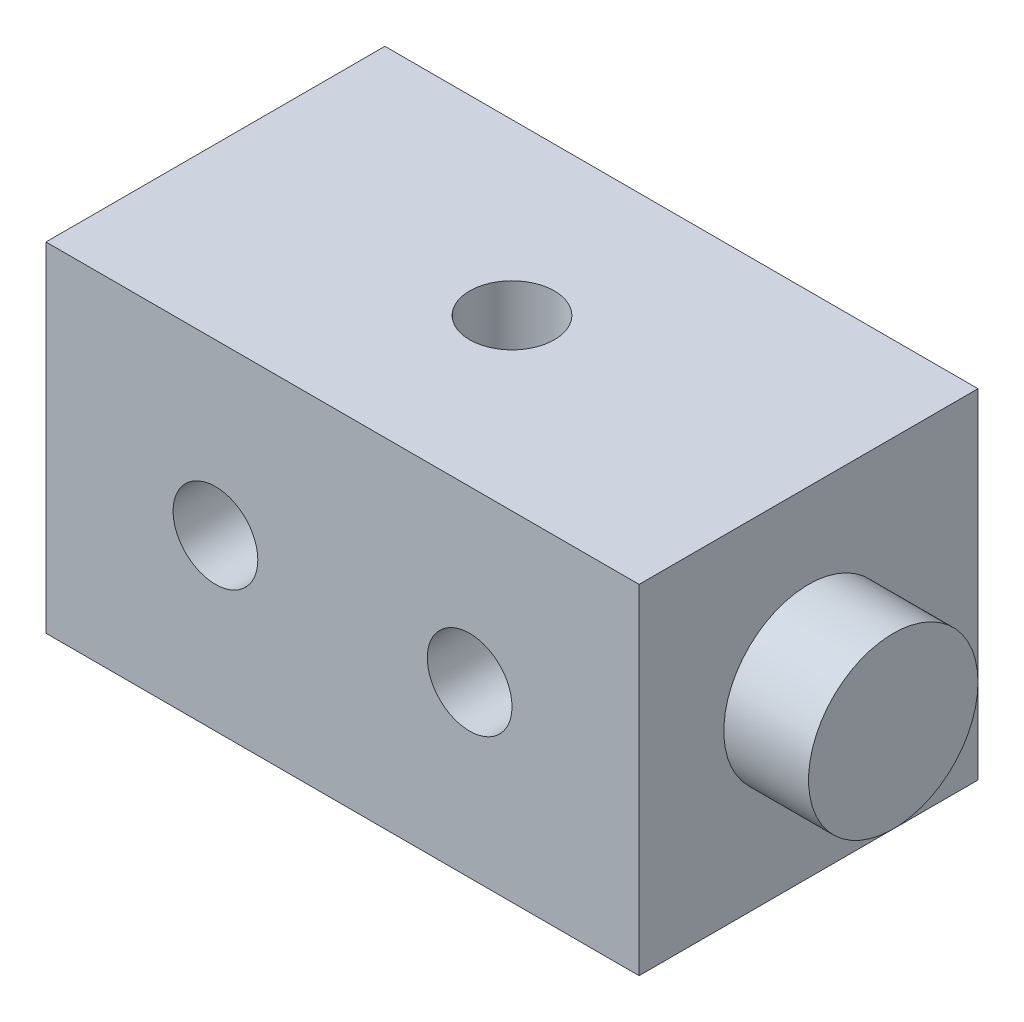
ISO-10303-21;
HEADER;
FILE_DESCRIPTION(('STEP AP214'),'2;1');
FILE_NAME('part.step','',(''),(''),'','','');
FILE_SCHEMA(('AUTOMOTIVE_DESIGN { 1 0 10303 214 1 1 1 1 }'));
ENDSEC;
DATA;
#1=APPLICATION_CONTEXT('core data for automotive mechanical design processes');
#2=APPLICATION_PROTOCOL_DEFINITION('international standard','automotive_design',2000,#1);
#3=PRODUCT_CONTEXT('',#1,'mechanical');
#4=PRODUCT('Part','Part','',(#3));
#5=PRODUCT_RELATED_PRODUCT_CATEGORY('part','',(#4));
#6=PRODUCT_DEFINITION_FORMATION('','',#4);
#7=PRODUCT_DEFINITION_CONTEXT('part definition',#1,'design');
#8=PRODUCT_DEFINITION('design','',#6,#7);
#9=PRODUCT_DEFINITION_SHAPE('','',#8);
#10=(LENGTH_UNIT() NAMED_UNIT(*) SI_UNIT(.MILLI.,.METRE.));
#11=(NAMED_UNIT(*) PLANE_ANGLE_UNIT() SI_UNIT($,.RADIAN.));
#12=(NAMED_UNIT(*) SI_UNIT($,.STERADIAN.) SOLID_ANGLE_UNIT());
#13=UNCERTAINTY_MEASURE_WITH_UNIT(LENGTH_MEASURE(1.E-05),#10,'distance_accuracy_value','');
#14=(GEOMETRIC_REPRESENTATION_CONTEXT(3) GLOBAL_UNCERTAINTY_ASSIGNED_CONTEXT((#13)) GLOBAL_UNIT_ASSIGNED_CONTEXT((#10,
#11,#12)) REPRESENTATION_CONTEXT('',''));
#15=CARTESIAN_POINT('',(0.,0.,0.));
#16=DIRECTION('',(0.,0.,1.));
#17=DIRECTION('',(1.,0.,0.));
#18=AXIS2_PLACEMENT_3D('',#15,#16,#17);
#19=CARTESIAN_POINT('',(0.,0.,25.4));
#20=DIRECTION('',(0.,0.,-1.));
#21=DIRECTION('',(-1.,0.,0.));
#22=AXIS2_PLACEMENT_3D('',#19,#20,#21);
#23=PLANE('',#22);
#24=DIRECTION('',(0.,-1.,0.));
#25=VECTOR('',#24,1.);
#26=CARTESIAN_POINT('',(0.,0.,25.4));
#27=LINE('',#26,#25);
#28=CARTESIAN_POINT('',(0.,25.4,25.4));
#29=VERTEX_POINT('',#28);
#30=CARTESIAN_POINT('',(0.,0.,25.4));
#31=VERTEX_POINT('',#30);
#32=EDGE_CURVE('E93',#29,#31,#27,.T.);
#33=ORIENTED_EDGE('',*,*,#32,.T.);
#34=DIRECTION('',(1.,0.,0.));
#35=VECTOR('',#34,1.);
#36=CARTESIAN_POINT('',(0.,0.,25.4));
#37=LINE('',#36,#35);
#38=CARTESIAN_POINT('',(44.45,0.,25.4));
#39=VERTEX_POINT('',#38);
#40=EDGE_CURVE('E88',#31,#39,#37,.T.);
#41=ORIENTED_EDGE('',*,*,#40,.T.);
#42=DIRECTION('',(0.,1.,0.));
#43=VECTOR('',#42,1.);
#44=CARTESIAN_POINT('',(44.45,0.,25.4));
#45=LINE('',#44,#43);
#46=CARTESIAN_POINT('',(44.45,25.4,25.4));
#47=VERTEX_POINT('',#46);
#48=EDGE_CURVE('E91',#39,#47,#45,.T.);
#49=ORIENTED_EDGE('',*,*,#48,.T.);
#50=DIRECTION('',(-1.,0.,0.));
#51=VECTOR('',#50,1.);
#52=CARTESIAN_POINT('',(0.,25.4,25.4));
#53=LINE('',#52,#51);
#54=EDGE_CURVE('E57',#47,#29,#53,.T.);
#55=ORIENTED_EDGE('',*,*,#54,.T.);
#56=EDGE_LOOP('',(#33,#41,#49,#55));
#57=FACE_BOUND('',#56,.T.);
#58=CARTESIAN_POINT('',(12.7,12.7,25.4));
#59=DIRECTION('',(0.,0.,1.));
#60=DIRECTION('',(1.,0.,0.));
#61=AXIS2_PLACEMENT_3D('',#58,#59,#60);
#62=CIRCLE('',#61,3.175);
#63=CARTESIAN_POINT('',(15.875,12.7,25.4));
#64=VERTEX_POINT('',#63);
#65=EDGE_CURVE('E114',#64,#64,#62,.T.);
#66=ORIENTED_EDGE('',*,*,#65,.F.);
#67=EDGE_LOOP('',(#66));
#68=FACE_BOUND('',#67,.T.);
#69=CARTESIAN_POINT('',(31.75,12.7,25.4));
#70=DIRECTION('',(0.,0.,1.));
#71=DIRECTION('',(1.,0.,0.));
#72=AXIS2_PLACEMENT_3D('',#69,#70,#71);
#73=CIRCLE('',#72,3.175);
#74=CARTESIAN_POINT('',(34.925,12.7,25.4));
#75=VERTEX_POINT('',#74);
#76=EDGE_CURVE('E136',#75,#75,#73,.T.);
#77=ORIENTED_EDGE('',*,*,#76,.F.);
#78=EDGE_LOOP('',(#77));
#79=FACE_BOUND('',#78,.T.);
#80=ADVANCED_FACE('F38',(#57,#68,#79),#23,.F.);
#81=CARTESIAN_POINT('',(0.,0.,0.));
#82=DIRECTION('',(0.,0.,-1.));
#83=DIRECTION('',(-1.,0.,0.));
#84=AXIS2_PLACEMENT_3D('',#81,#82,#83);
#85=PLANE('',#84);
#86=CARTESIAN_POINT('',(12.7,12.7,0.));
#87=DIRECTION('',(0.,0.,1.));
#88=DIRECTION('',(1.,0.,0.));
#89=AXIS2_PLACEMENT_3D('',#86,#87,#88);
#90=CIRCLE('',#89,3.175);
#91=CARTESIAN_POINT('',(15.875,12.7,0.));
#92=VERTEX_POINT('',#91);
#93=EDGE_CURVE('E132',#92,#92,#90,.T.);
#94=ORIENTED_EDGE('',*,*,#93,.T.);
#95=EDGE_LOOP('',(#94));
#96=FACE_BOUND('',#95,.T.);
#97=DIRECTION('',(0.,-1.,0.));
#98=VECTOR('',#97,1.);
#99=CARTESIAN_POINT('',(0.,0.,0.));
#100=LINE('',#99,#98);
#101=CARTESIAN_POINT('',(0.,25.4,0.));
#102=VERTEX_POINT('',#101);
#103=CARTESIAN_POINT('',(0.,0.,0.));
#104=VERTEX_POINT('',#103);
#105=EDGE_CURVE('E110',#102,#104,#100,.T.);
#106=ORIENTED_EDGE('',*,*,#105,.F.);
#107=DIRECTION('',(-1.,0.,0.));
#108=VECTOR('',#107,1.);
#109=CARTESIAN_POINT('',(0.,25.4,0.));
#110=LINE('',#109,#108);
#111=CARTESIAN_POINT('',(44.45,25.4,0.));
#112=VERTEX_POINT('',#111);
#113=EDGE_CURVE('E80',#112,#102,#110,.T.);
#114=ORIENTED_EDGE('',*,*,#113,.F.);
#115=DIRECTION('',(0.,1.,0.));
#116=VECTOR('',#115,1.);
#117=CARTESIAN_POINT('',(44.45,0.,0.));
#118=LINE('',#117,#116);
#119=CARTESIAN_POINT('',(44.45,0.,0.));
#120=VERTEX_POINT('',#119);
#121=EDGE_CURVE('E74',#120,#112,#118,.T.);
#122=ORIENTED_EDGE('',*,*,#121,.F.);
#123=DIRECTION('',(1.,0.,0.));
#124=VECTOR('',#123,1.);
#125=CARTESIAN_POINT('',(0.,0.,0.));
#126=LINE('',#125,#124);
#127=EDGE_CURVE('E99',#104,#120,#126,.T.);
#128=ORIENTED_EDGE('',*,*,#127,.F.);
#129=EDGE_LOOP('',(#106,#114,#122,#128));
#130=FACE_BOUND('',#129,.T.);
#131=CARTESIAN_POINT('',(31.75,12.7,0.));
#132=DIRECTION('',(0.,0.,1.));
#133=DIRECTION('',(1.,0.,0.));
#134=AXIS2_PLACEMENT_3D('',#131,#132,#133);
#135=CIRCLE('',#134,3.175);
#136=CARTESIAN_POINT('',(34.925,12.7,0.));
#137=VERTEX_POINT('',#136);
#138=EDGE_CURVE('E140',#137,#137,#135,.T.);
#139=ORIENTED_EDGE('',*,*,#138,.T.);
#140=EDGE_LOOP('',(#139));
#141=FACE_BOUND('',#140,.T.);
#142=ADVANCED_FACE('F127',(#96,#130,#141),#85,.T.);
#143=CARTESIAN_POINT('',(0.,0.,25.4));
#144=DIRECTION('',(1.,0.,0.));
#145=DIRECTION('',(0.,0.,-1.));
#146=AXIS2_PLACEMENT_3D('',#143,#144,#145);
#147=PLANE('',#146);
#148=ORIENTED_EDGE('',*,*,#105,.T.);
#149=DIRECTION('',(0.,0.,-1.));
#150=VECTOR('',#149,1.);
#151=CARTESIAN_POINT('',(0.,0.,25.4));
#152=LINE('',#151,#150);
#153=EDGE_CURVE('E42',#31,#104,#152,.T.);
#154=ORIENTED_EDGE('',*,*,#153,.F.);
#155=ORIENTED_EDGE('',*,*,#32,.F.);
#156=DIRECTION('',(0.,0.,-1.));
#157=VECTOR('',#156,1.);
#158=CARTESIAN_POINT('',(0.,25.4,25.4));
#159=LINE('',#158,#157);
#160=EDGE_CURVE('E106',#29,#102,#159,.T.);
#161=ORIENTED_EDGE('',*,*,#160,.T.);
#162=EDGE_LOOP('',(#148,#154,#155,#161));
#163=FACE_BOUND('',#162,.T.);
#164=ADVANCED_FACE('F40',(#163),#147,.F.);
#165=CARTESIAN_POINT('',(0.,0.,25.4));
#166=DIRECTION('',(0.,1.,0.));
#167=DIRECTION('',(0.,0.,1.));
#168=AXIS2_PLACEMENT_3D('',#165,#166,#167);
#169=PLANE('',#168);
#170=CARTESIAN_POINT('',(22.225,0.,12.7));
#171=DIRECTION('',(0.,1.,0.));
#172=DIRECTION('',(0.,0.,1.));
#173=AXIS2_PLACEMENT_3D('',#170,#171,#172);
#174=CIRCLE('',#173,3.175);
#175=CARTESIAN_POINT('',(22.225,0.,15.875));
#176=VERTEX_POINT('',#175);
#177=EDGE_CURVE('E151',#176,#176,#174,.T.);
#178=ORIENTED_EDGE('',*,*,#177,.T.);
#179=EDGE_LOOP('',(#178));
#180=FACE_BOUND('',#179,.T.);
#181=ORIENTED_EDGE('',*,*,#127,.T.);
#182=DIRECTION('',(0.,0.,-1.));
#183=VECTOR('',#182,1.);
#184=CARTESIAN_POINT('',(44.45,0.,25.4));
#185=LINE('',#184,#183);
#186=EDGE_CURVE('E97',#39,#120,#185,.T.);
#187=ORIENTED_EDGE('',*,*,#186,.F.);
#188=ORIENTED_EDGE('',*,*,#40,.F.);
#189=ORIENTED_EDGE('',*,*,#153,.T.);
#190=EDGE_LOOP('',(#181,#187,#188,#189));
#191=FACE_BOUND('',#190,.T.);
#192=ADVANCED_FACE('F98',(#180,#191),#169,.F.);
#193=CARTESIAN_POINT('',(44.45,0.,25.4));
#194=DIRECTION('',(-1.,0.,0.));
#195=DIRECTION('',(0.,0.,1.));
#196=AXIS2_PLACEMENT_3D('',#193,#194,#195);
#197=PLANE('',#196);
#198=CARTESIAN_POINT('',(44.45,12.7,12.7));
#199=DIRECTION('',(1.,0.,0.));
#200=DIRECTION('',(0.,0.,-1.));
#201=AXIS2_PLACEMENT_3D('',#198,#199,#200);
#202=CIRCLE('',#201,6.35);
#203=CARTESIAN_POINT('',(44.45,12.7,6.35));
#204=VERTEX_POINT('',#203);
#205=EDGE_CURVE('E11',#204,#204,#202,.T.);
#206=ORIENTED_EDGE('',*,*,#205,.F.);
#207=EDGE_LOOP('',(#206));
#208=FACE_BOUND('',#207,.T.);
#209=ORIENTED_EDGE('',*,*,#121,.T.);
#210=DIRECTION('',(0.,0.,-1.));
#211=VECTOR('',#210,1.);
#212=CARTESIAN_POINT('',(44.45,25.4,25.4));
#213=LINE('',#212,#211);
#214=EDGE_CURVE('E101',#47,#112,#213,.T.);
#215=ORIENTED_EDGE('',*,*,#214,.F.);
#216=ORIENTED_EDGE('',*,*,#48,.F.);
#217=ORIENTED_EDGE('',*,*,#186,.T.);
#218=EDGE_LOOP('',(#209,#215,#216,#217));
#219=FACE_BOUND('',#218,.T.);
#220=ADVANCED_FACE('F102',(#208,#219),#197,.F.);
#221=CARTESIAN_POINT('',(0.,25.4,25.4));
#222=DIRECTION('',(0.,-1.,0.));
#223=DIRECTION('',(0.,0.,-1.));
#224=AXIS2_PLACEMENT_3D('',#221,#222,#223);
#225=PLANE('',#224);
#226=CARTESIAN_POINT('',(22.225,25.4,12.7));
#227=DIRECTION('',(0.,1.,0.));
#228=DIRECTION('',(0.,0.,1.));
#229=AXIS2_PLACEMENT_3D('',#226,#227,#228);
#230=CIRCLE('',#229,3.175);
#231=CARTESIAN_POINT('',(22.225,25.4,15.875));
#232=VERTEX_POINT('',#231);
#233=EDGE_CURVE('E152',#232,#232,#230,.T.);
#234=ORIENTED_EDGE('',*,*,#233,.F.);
#235=EDGE_LOOP('',(#234));
#236=FACE_BOUND('',#235,.T.);
#237=ORIENTED_EDGE('',*,*,#113,.T.);
#238=ORIENTED_EDGE('',*,*,#160,.F.);
#239=ORIENTED_EDGE('',*,*,#54,.F.);
#240=ORIENTED_EDGE('',*,*,#214,.T.);
#241=EDGE_LOOP('',(#237,#238,#239,#240));
#242=FACE_BOUND('',#241,.T.);
#243=ADVANCED_FACE('F124',(#236,#242),#225,.F.);
#244=CARTESIAN_POINT('',(12.7,12.7,25.4));
#245=DIRECTION('',(0.,0.,-1.));
#246=DIRECTION('',(-1.,0.,0.));
#247=AXIS2_PLACEMENT_3D('',#244,#245,#246);
#248=CYLINDRICAL_SURFACE('',#247,3.175);
#249=ORIENTED_EDGE('',*,*,#65,.T.);
#250=EDGE_LOOP('',(#249));
#251=FACE_BOUND('',#250,.T.);
#252=ORIENTED_EDGE('',*,*,#93,.F.);
#253=EDGE_LOOP('',(#252));
#254=FACE_BOUND('',#253,.T.);
#255=ADVANCED_FACE('F169',(#251,#254),#248,.F.);
#256=CARTESIAN_POINT('',(31.75,12.7,25.4));
#257=DIRECTION('',(0.,0.,-1.));
#258=DIRECTION('',(-1.,0.,0.));
#259=AXIS2_PLACEMENT_3D('',#256,#257,#258);
#260=CYLINDRICAL_SURFACE('',#259,3.175);
#261=ORIENTED_EDGE('',*,*,#76,.T.);
#262=EDGE_LOOP('',(#261));
#263=FACE_BOUND('',#262,.T.);
#264=ORIENTED_EDGE('',*,*,#138,.F.);
#265=EDGE_LOOP('',(#264));
#266=FACE_BOUND('',#265,.T.);
#267=ADVANCED_FACE('F176',(#263,#266),#260,.F.);
#268=CARTESIAN_POINT('',(50.8,12.7,12.7));
#269=DIRECTION('',(-1.,0.,0.));
#270=DIRECTION('',(0.,0.,1.));
#271=AXIS2_PLACEMENT_3D('',#268,#269,#270);
#272=CYLINDRICAL_SURFACE('',#271,6.35);
#273=CARTESIAN_POINT('',(50.8,12.7,12.7));
#274=DIRECTION('',(1.,0.,0.));
#275=DIRECTION('',(0.,0.,-1.));
#276=AXIS2_PLACEMENT_3D('',#273,#274,#275);
#277=CIRCLE('',#276,6.35);
#278=CARTESIAN_POINT('',(50.8,12.7,6.35));
#279=VERTEX_POINT('',#278);
#280=EDGE_CURVE('E144',#279,#279,#277,.T.);
#281=ORIENTED_EDGE('',*,*,#280,.F.);
#282=EDGE_LOOP('',(#281));
#283=FACE_BOUND('',#282,.T.);
#284=ORIENTED_EDGE('',*,*,#205,.T.);
#285=EDGE_LOOP('',(#284));
#286=FACE_BOUND('',#285,.T.);
#287=ADVANCED_FACE('F192',(#283,#286),#272,.T.);
#288=CARTESIAN_POINT('',(50.8,12.7,12.7));
#289=DIRECTION('',(1.,0.,0.));
#290=DIRECTION('',(0.,0.,-1.));
#291=AXIS2_PLACEMENT_3D('',#288,#289,#290);
#292=PLANE('',#291);
#293=ORIENTED_EDGE('',*,*,#280,.T.);
#294=EDGE_LOOP('',(#293));
#295=FACE_BOUND('',#294,.T.);
#296=ADVANCED_FACE('F164',(#295),#292,.T.);
#297=CARTESIAN_POINT('',(22.225,0.,12.7));
#298=DIRECTION('',(0.,1.,0.));
#299=DIRECTION('',(0.,0.,1.));
#300=AXIS2_PLACEMENT_3D('',#297,#298,#299);
#301=CYLINDRICAL_SURFACE('',#300,3.175);
#302=ORIENTED_EDGE('',*,*,#177,.F.);
#303=EDGE_LOOP('',(#302));
#304=FACE_BOUND('',#303,.T.);
#305=ORIENTED_EDGE('',*,*,#233,.T.);
#306=EDGE_LOOP('',(#305));
#307=FACE_BOUND('',#306,.T.);
#308=ADVANCED_FACE('F161',(#304,#307),#301,.F.);
#309=CLOSED_SHELL('',(#80,#142,#164,#192,#220,#243,#255,#267,#287,#296,#308));
#310=MANIFOLD_SOLID_BREP('B2',#309);
#311=ADVANCED_BREP_SHAPE_REPRESENTATION('',(#18,#310),#14);
#312=SHAPE_DEFINITION_REPRESENTATION(#9,#311);
ENDSEC;
END-ISO-10303-21;
